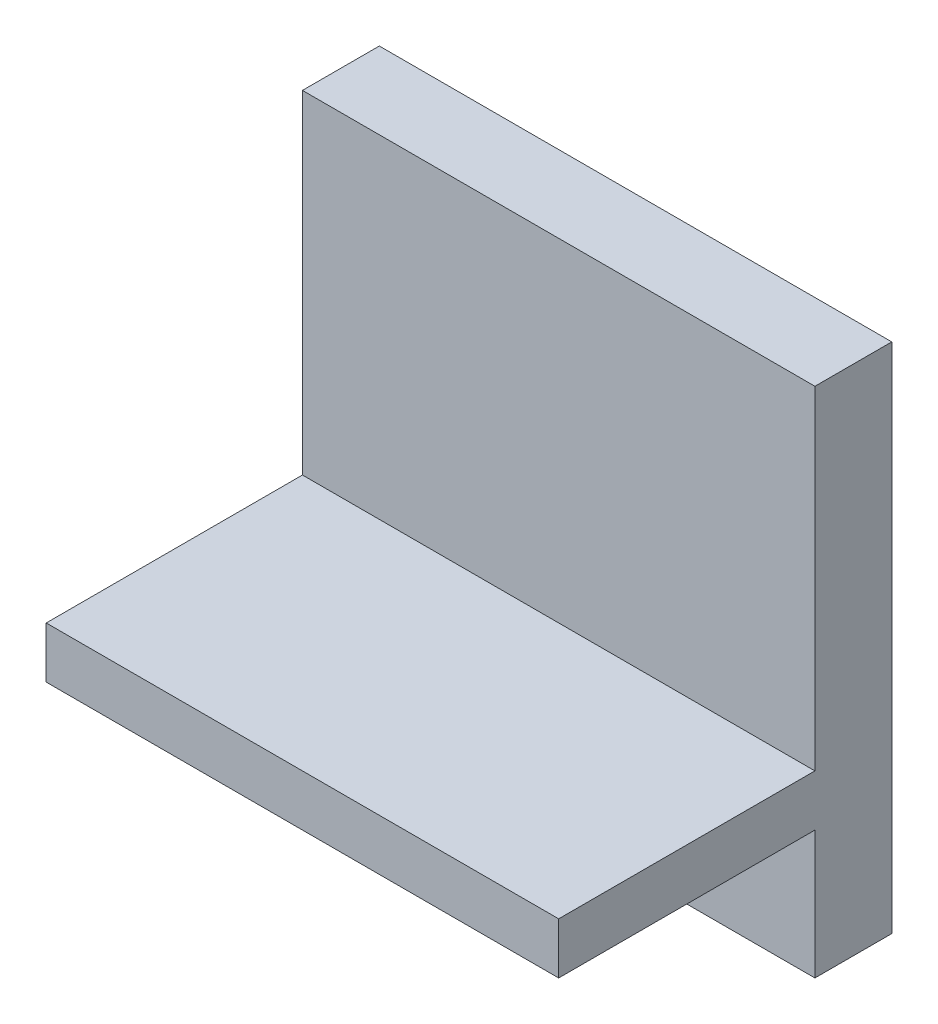
ISO-10303-21;
HEADER;
FILE_DESCRIPTION(('STEP AP214'),'2;1');
FILE_NAME('part.step','',(''),(''),'','','');
FILE_SCHEMA(('AUTOMOTIVE_DESIGN { 1 0 10303 214 1 1 1 1 }'));
ENDSEC;
DATA;
#1=APPLICATION_CONTEXT('core data for automotive mechanical design processes');
#2=APPLICATION_PROTOCOL_DEFINITION('international standard','automotive_design',2000,#1);
#3=PRODUCT_CONTEXT('',#1,'mechanical');
#4=PRODUCT('Part','Part','',(#3));
#5=PRODUCT_RELATED_PRODUCT_CATEGORY('part','',(#4));
#6=PRODUCT_DEFINITION_FORMATION('','',#4);
#7=PRODUCT_DEFINITION_CONTEXT('part definition',#1,'design');
#8=PRODUCT_DEFINITION('design','',#6,#7);
#9=PRODUCT_DEFINITION_SHAPE('','',#8);
#10=(LENGTH_UNIT() NAMED_UNIT(*) SI_UNIT(.MILLI.,.METRE.));
#11=(NAMED_UNIT(*) PLANE_ANGLE_UNIT() SI_UNIT($,.RADIAN.));
#12=(NAMED_UNIT(*) SI_UNIT($,.STERADIAN.) SOLID_ANGLE_UNIT());
#13=UNCERTAINTY_MEASURE_WITH_UNIT(LENGTH_MEASURE(1.E-05),#10,'distance_accuracy_value','');
#14=(GEOMETRIC_REPRESENTATION_CONTEXT(3) GLOBAL_UNCERTAINTY_ASSIGNED_CONTEXT((#13)) GLOBAL_UNIT_ASSIGNED_CONTEXT((#10,
#11,#12)) REPRESENTATION_CONTEXT('',''));
#15=CARTESIAN_POINT('',(0.,0.,0.));
#16=DIRECTION('',(0.,0.,1.));
#17=DIRECTION('',(1.,0.,0.));
#18=AXIS2_PLACEMENT_3D('',#15,#16,#17);
#19=CARTESIAN_POINT('',(0.,20.,0.));
#20=DIRECTION('',(0.,0.,-1.));
#21=DIRECTION('',(-1.,0.,0.));
#22=AXIS2_PLACEMENT_3D('',#19,#20,#21);
#23=PLANE('',#22);
#24=DIRECTION('',(1.,0.,0.));
#25=VECTOR('',#24,1.);
#26=CARTESIAN_POINT('',(15.,5.,0.));
#27=LINE('',#26,#25);
#28=CARTESIAN_POINT('',(0.,5.,0.));
#29=VERTEX_POINT('',#28);
#30=CARTESIAN_POINT('',(5.,5.,0.));
#31=VERTEX_POINT('',#30);
#32=EDGE_CURVE('E153',#29,#31,#27,.T.);
#33=ORIENTED_EDGE('',*,*,#32,.F.);
#34=DIRECTION('',(0.,-1.,0.));
#35=VECTOR('',#34,1.);
#36=CARTESIAN_POINT('',(0.,20.,0.));
#37=LINE('',#36,#35);
#38=CARTESIAN_POINT('',(0.,0.,0.));
#39=VERTEX_POINT('',#38);
#40=EDGE_CURVE('E41',#29,#39,#37,.T.);
#41=ORIENTED_EDGE('',*,*,#40,.T.);
#42=DIRECTION('',(1.,0.,0.));
#43=VECTOR('',#42,1.);
#44=CARTESIAN_POINT('',(0.,0.,0.));
#45=LINE('',#44,#43);
#46=CARTESIAN_POINT('',(5.,0.,0.));
#47=VERTEX_POINT('',#46);
#48=EDGE_CURVE('E56',#39,#47,#45,.T.);
#49=ORIENTED_EDGE('',*,*,#48,.T.);
#50=DIRECTION('',(0.,-1.,0.));
#51=VECTOR('',#50,1.);
#52=CARTESIAN_POINT('',(5.,0.,0.));
#53=LINE('',#52,#51);
#54=EDGE_CURVE('E165',#31,#47,#53,.T.);
#55=ORIENTED_EDGE('',*,*,#54,.F.);
#56=EDGE_LOOP('',(#33,#41,#49,#55));
#57=FACE_BOUND('',#56,.T.);
#58=ADVANCED_FACE('F33',(#57),#23,.F.);
#59=CARTESIAN_POINT('',(15.,5.,0.));
#60=VERTEX_POINT('',#59);
#61=CARTESIAN_POINT('',(20.,5.,0.));
#62=VERTEX_POINT('',#61);
#63=EDGE_CURVE('E139',#60,#62,#27,.T.);
#64=ORIENTED_EDGE('',*,*,#63,.F.);
#65=DIRECTION('',(0.,1.,0.));
#66=VECTOR('',#65,1.);
#67=CARTESIAN_POINT('',(15.,5.,0.));
#68=LINE('',#67,#66);
#69=CARTESIAN_POINT('',(15.,0.,0.));
#70=VERTEX_POINT('',#69);
#71=EDGE_CURVE('E48',#70,#60,#68,.T.);
#72=ORIENTED_EDGE('',*,*,#71,.F.);
#73=CARTESIAN_POINT('',(20.,0.,0.));
#74=VERTEX_POINT('',#73);
#75=EDGE_CURVE('E200',#70,#74,#45,.T.);
#76=ORIENTED_EDGE('',*,*,#75,.T.);
#77=DIRECTION('',(0.,-1.,0.));
#78=VECTOR('',#77,1.);
#79=CARTESIAN_POINT('',(20.,20.,0.));
#80=LINE('',#79,#78);
#81=EDGE_CURVE('E209',#62,#74,#80,.T.);
#82=ORIENTED_EDGE('',*,*,#81,.F.);
#83=EDGE_LOOP('',(#64,#72,#76,#82));
#84=FACE_BOUND('',#83,.T.);
#85=ADVANCED_FACE('F215',(#84),#23,.F.);
#86=DIRECTION('',(-1.,0.,0.));
#87=VECTOR('',#86,1.);
#88=CARTESIAN_POINT('',(20.,7.,0.));
#89=LINE('',#88,#87);
#90=CARTESIAN_POINT('',(20.,7.,0.));
#91=VERTEX_POINT('',#90);
#92=CARTESIAN_POINT('',(0.,7.,0.));
#93=VERTEX_POINT('',#92);
#94=EDGE_CURVE('E134',#91,#93,#89,.T.);
#95=ORIENTED_EDGE('',*,*,#94,.F.);
#96=CARTESIAN_POINT('',(20.,20.,0.));
#97=VERTEX_POINT('',#96);
#98=EDGE_CURVE('E210',#97,#91,#80,.T.);
#99=ORIENTED_EDGE('',*,*,#98,.F.);
#100=DIRECTION('',(1.,0.,0.));
#101=VECTOR('',#100,1.);
#102=CARTESIAN_POINT('',(0.,20.,0.));
#103=LINE('',#102,#101);
#104=CARTESIAN_POINT('',(0.,20.,0.));
#105=VERTEX_POINT('',#104);
#106=EDGE_CURVE('E190',#105,#97,#103,.T.);
#107=ORIENTED_EDGE('',*,*,#106,.F.);
#108=EDGE_CURVE('E11',#105,#93,#37,.T.);
#109=ORIENTED_EDGE('',*,*,#108,.T.);
#110=EDGE_LOOP('',(#95,#99,#107,#109));
#111=FACE_BOUND('',#110,.T.);
#112=ADVANCED_FACE('F233',(#111),#23,.F.);
#113=CARTESIAN_POINT('',(0.,20.,-3.));
#114=DIRECTION('',(1.,0.,0.));
#115=DIRECTION('',(0.,0.,-1.));
#116=AXIS2_PLACEMENT_3D('',#113,#114,#115);
#117=PLANE('',#116);
#118=DIRECTION('',(0.,0.,1.));
#119=VECTOR('',#118,1.);
#120=CARTESIAN_POINT('',(0.,0.,-3.));
#121=LINE('',#120,#119);
#122=CARTESIAN_POINT('',(0.,0.,-3.));
#123=VERTEX_POINT('',#122);
#124=EDGE_CURVE('E186',#123,#39,#121,.T.);
#125=ORIENTED_EDGE('',*,*,#124,.T.);
#126=ORIENTED_EDGE('',*,*,#40,.F.);
#127=DIRECTION('',(0.,0.,-1.));
#128=VECTOR('',#127,1.);
#129=CARTESIAN_POINT('',(0.,5.,10.));
#130=LINE('',#129,#128);
#131=CARTESIAN_POINT('',(0.,5.,10.));
#132=VERTEX_POINT('',#131);
#133=EDGE_CURVE('E152',#132,#29,#130,.T.);
#134=ORIENTED_EDGE('',*,*,#133,.F.);
#135=DIRECTION('',(0.,-1.,0.));
#136=VECTOR('',#135,1.);
#137=CARTESIAN_POINT('',(0.,7.,10.));
#138=LINE('',#137,#136);
#139=CARTESIAN_POINT('',(0.,7.,10.));
#140=VERTEX_POINT('',#139);
#141=EDGE_CURVE('E131',#140,#132,#138,.T.);
#142=ORIENTED_EDGE('',*,*,#141,.F.);
#143=DIRECTION('',(0.,0.,-1.));
#144=VECTOR('',#143,1.);
#145=CARTESIAN_POINT('',(0.,7.,10.));
#146=LINE('',#145,#144);
#147=EDGE_CURVE('E157',#140,#93,#146,.T.);
#148=ORIENTED_EDGE('',*,*,#147,.T.);
#149=ORIENTED_EDGE('',*,*,#108,.F.);
#150=DIRECTION('',(0.,0.,1.));
#151=VECTOR('',#150,1.);
#152=CARTESIAN_POINT('',(0.,20.,-3.));
#153=LINE('',#152,#151);
#154=CARTESIAN_POINT('',(0.,20.,-3.));
#155=VERTEX_POINT('',#154);
#156=EDGE_CURVE('E187',#155,#105,#153,.T.);
#157=ORIENTED_EDGE('',*,*,#156,.F.);
#158=DIRECTION('',(0.,-1.,0.));
#159=VECTOR('',#158,1.);
#160=CARTESIAN_POINT('',(0.,20.,-3.));
#161=LINE('',#160,#159);
#162=EDGE_CURVE('E197',#155,#123,#161,.T.);
#163=ORIENTED_EDGE('',*,*,#162,.T.);
#164=EDGE_LOOP('',(#125,#126,#134,#142,#148,#149,#157,#163));
#165=FACE_BOUND('',#164,.T.);
#166=ADVANCED_FACE('F35',(#165),#117,.F.);
#167=CARTESIAN_POINT('',(20.,20.,0.));
#168=DIRECTION('',(-1.,0.,0.));
#169=DIRECTION('',(0.,0.,1.));
#170=AXIS2_PLACEMENT_3D('',#167,#168,#169);
#171=PLANE('',#170);
#172=DIRECTION('',(0.,0.,-1.));
#173=VECTOR('',#172,1.);
#174=CARTESIAN_POINT('',(20.,0.,0.));
#175=LINE('',#174,#173);
#176=CARTESIAN_POINT('',(20.,0.,-3.));
#177=VERTEX_POINT('',#176);
#178=EDGE_CURVE('E202',#74,#177,#175,.T.);
#179=ORIENTED_EDGE('',*,*,#178,.T.);
#180=DIRECTION('',(0.,-1.,0.));
#181=VECTOR('',#180,1.);
#182=CARTESIAN_POINT('',(20.,20.,-3.));
#183=LINE('',#182,#181);
#184=CARTESIAN_POINT('',(20.,20.,-3.));
#185=VERTEX_POINT('',#184);
#186=EDGE_CURVE('E207',#185,#177,#183,.T.);
#187=ORIENTED_EDGE('',*,*,#186,.F.);
#188=DIRECTION('',(0.,0.,-1.));
#189=VECTOR('',#188,1.);
#190=CARTESIAN_POINT('',(20.,20.,0.));
#191=LINE('',#190,#189);
#192=EDGE_CURVE('E193',#97,#185,#191,.T.);
#193=ORIENTED_EDGE('',*,*,#192,.F.);
#194=ORIENTED_EDGE('',*,*,#98,.T.);
#195=DIRECTION('',(0.,0.,-1.));
#196=VECTOR('',#195,1.);
#197=CARTESIAN_POINT('',(20.,7.,10.));
#198=LINE('',#197,#196);
#199=CARTESIAN_POINT('',(20.,7.,10.));
#200=VERTEX_POINT('',#199);
#201=EDGE_CURVE('E142',#200,#91,#198,.T.);
#202=ORIENTED_EDGE('',*,*,#201,.F.);
#203=DIRECTION('',(0.,1.,0.));
#204=VECTOR('',#203,1.);
#205=CARTESIAN_POINT('',(20.,5.,10.));
#206=LINE('',#205,#204);
#207=CARTESIAN_POINT('',(20.,5.,10.));
#208=VERTEX_POINT('',#207);
#209=EDGE_CURVE('E128',#208,#200,#206,.T.);
#210=ORIENTED_EDGE('',*,*,#209,.F.);
#211=DIRECTION('',(0.,0.,-1.));
#212=VECTOR('',#211,1.);
#213=CARTESIAN_POINT('',(20.,5.,10.));
#214=LINE('',#213,#212);
#215=EDGE_CURVE('E137',#208,#62,#214,.T.);
#216=ORIENTED_EDGE('',*,*,#215,.T.);
#217=ORIENTED_EDGE('',*,*,#81,.T.);
#218=EDGE_LOOP('',(#179,#187,#193,#194,#202,#210,#216,#217));
#219=FACE_BOUND('',#218,.T.);
#220=ADVANCED_FACE('F144',(#219),#171,.F.);
#221=CARTESIAN_POINT('',(20.,20.,-3.));
#222=DIRECTION('',(0.,0.,1.));
#223=DIRECTION('',(1.,0.,0.));
#224=AXIS2_PLACEMENT_3D('',#221,#222,#223);
#225=PLANE('',#224);
#226=DIRECTION('',(-1.,0.,0.));
#227=VECTOR('',#226,1.);
#228=CARTESIAN_POINT('',(20.,0.,-3.));
#229=LINE('',#228,#227);
#230=EDGE_CURVE('E191',#177,#123,#229,.T.);
#231=ORIENTED_EDGE('',*,*,#230,.T.);
#232=ORIENTED_EDGE('',*,*,#162,.F.);
#233=DIRECTION('',(-1.,0.,0.));
#234=VECTOR('',#233,1.);
#235=CARTESIAN_POINT('',(20.,20.,-3.));
#236=LINE('',#235,#234);
#237=EDGE_CURVE('E195',#185,#155,#236,.T.);
#238=ORIENTED_EDGE('',*,*,#237,.F.);
#239=ORIENTED_EDGE('',*,*,#186,.T.);
#240=EDGE_LOOP('',(#231,#232,#238,#239));
#241=FACE_BOUND('',#240,.T.);
#242=ADVANCED_FACE('F223',(#241),#225,.F.);
#243=CARTESIAN_POINT('',(0.,20.,0.));
#244=DIRECTION('',(0.,1.,0.));
#245=DIRECTION('',(0.,0.,1.));
#246=AXIS2_PLACEMENT_3D('',#243,#244,#245);
#247=PLANE('',#246);
#248=ORIENTED_EDGE('',*,*,#156,.T.);
#249=ORIENTED_EDGE('',*,*,#106,.T.);
#250=ORIENTED_EDGE('',*,*,#192,.T.);
#251=ORIENTED_EDGE('',*,*,#237,.T.);
#252=EDGE_LOOP('',(#248,#249,#250,#251));
#253=FACE_BOUND('',#252,.T.);
#254=ADVANCED_FACE('F230',(#253),#247,.T.);
#255=CARTESIAN_POINT('',(0.,0.,0.));
#256=DIRECTION('',(0.,1.,0.));
#257=DIRECTION('',(0.,0.,1.));
#258=AXIS2_PLACEMENT_3D('',#255,#256,#257);
#259=PLANE('',#258);
#260=ORIENTED_EDGE('',*,*,#124,.F.);
#261=ORIENTED_EDGE('',*,*,#230,.F.);
#262=ORIENTED_EDGE('',*,*,#178,.F.);
#263=ORIENTED_EDGE('',*,*,#75,.F.);
#264=DIRECTION('',(0.,0.,-1.));
#265=VECTOR('',#264,1.);
#266=CARTESIAN_POINT('',(15.,0.,3.));
#267=LINE('',#266,#265);
#268=CARTESIAN_POINT('',(15.,0.,3.));
#269=VERTEX_POINT('',#268);
#270=EDGE_CURVE('E183',#269,#70,#267,.T.);
#271=ORIENTED_EDGE('',*,*,#270,.F.);
#272=DIRECTION('',(1.,0.,0.));
#273=VECTOR('',#272,1.);
#274=CARTESIAN_POINT('',(15.,0.,3.));
#275=LINE('',#274,#273);
#276=CARTESIAN_POINT('',(5.,0.,3.));
#277=VERTEX_POINT('',#276);
#278=EDGE_CURVE('E161',#277,#269,#275,.T.);
#279=ORIENTED_EDGE('',*,*,#278,.F.);
#280=DIRECTION('',(0.,0.,-1.));
#281=VECTOR('',#280,1.);
#282=CARTESIAN_POINT('',(5.,0.,3.));
#283=LINE('',#282,#281);
#284=EDGE_CURVE('E173',#277,#47,#283,.T.);
#285=ORIENTED_EDGE('',*,*,#284,.T.);
#286=ORIENTED_EDGE('',*,*,#48,.F.);
#287=EDGE_LOOP('',(#260,#261,#262,#263,#271,#279,#285,#286));
#288=FACE_BOUND('',#287,.T.);
#289=ADVANCED_FACE('F220',(#288),#259,.F.);
#290=CARTESIAN_POINT('',(15.,5.,3.));
#291=DIRECTION('',(-1.,0.,0.));
#292=DIRECTION('',(0.,-1.,0.));
#293=AXIS2_PLACEMENT_3D('',#290,#291,#292);
#294=PLANE('',#293);
#295=ORIENTED_EDGE('',*,*,#71,.T.);
#296=DIRECTION('',(0.,0.,-1.));
#297=VECTOR('',#296,1.);
#298=CARTESIAN_POINT('',(15.,5.,3.));
#299=LINE('',#298,#297);
#300=CARTESIAN_POINT('',(15.,5.,3.));
#301=VERTEX_POINT('',#300);
#302=EDGE_CURVE('E181',#301,#60,#299,.T.);
#303=ORIENTED_EDGE('',*,*,#302,.F.);
#304=DIRECTION('',(0.,1.,0.));
#305=VECTOR('',#304,1.);
#306=CARTESIAN_POINT('',(15.,5.,3.));
#307=LINE('',#306,#305);
#308=EDGE_CURVE('E164',#269,#301,#307,.T.);
#309=ORIENTED_EDGE('',*,*,#308,.F.);
#310=ORIENTED_EDGE('',*,*,#270,.T.);
#311=EDGE_LOOP('',(#295,#303,#309,#310));
#312=FACE_BOUND('',#311,.T.);
#313=ADVANCED_FACE('F247',(#312),#294,.F.);
#314=CARTESIAN_POINT('',(5.,0.,3.));
#315=DIRECTION('',(1.,0.,0.));
#316=DIRECTION('',(0.,1.,0.));
#317=AXIS2_PLACEMENT_3D('',#314,#315,#316);
#318=PLANE('',#317);
#319=ORIENTED_EDGE('',*,*,#54,.T.);
#320=ORIENTED_EDGE('',*,*,#284,.F.);
#321=DIRECTION('',(0.,-1.,0.));
#322=VECTOR('',#321,1.);
#323=CARTESIAN_POINT('',(5.,0.,3.));
#324=LINE('',#323,#322);
#325=CARTESIAN_POINT('',(5.,5.,3.));
#326=VERTEX_POINT('',#325);
#327=EDGE_CURVE('E171',#326,#277,#324,.T.);
#328=ORIENTED_EDGE('',*,*,#327,.F.);
#329=DIRECTION('',(0.,0.,-1.));
#330=VECTOR('',#329,1.);
#331=CARTESIAN_POINT('',(5.,5.,3.));
#332=LINE('',#331,#330);
#333=EDGE_CURVE('E178',#326,#31,#332,.T.);
#334=ORIENTED_EDGE('',*,*,#333,.T.);
#335=EDGE_LOOP('',(#319,#320,#328,#334));
#336=FACE_BOUND('',#335,.T.);
#337=ADVANCED_FACE('F241',(#336),#318,.F.);
#338=CARTESIAN_POINT('',(0.,0.,3.));
#339=DIRECTION('',(0.,0.,-1.));
#340=DIRECTION('',(-1.,0.,0.));
#341=AXIS2_PLACEMENT_3D('',#338,#339,#340);
#342=PLANE('',#341);
#343=ORIENTED_EDGE('',*,*,#278,.T.);
#344=ORIENTED_EDGE('',*,*,#308,.T.);
#345=DIRECTION('',(-1.,0.,0.));
#346=VECTOR('',#345,1.);
#347=CARTESIAN_POINT('',(5.,5.,3.));
#348=LINE('',#347,#346);
#349=EDGE_CURVE('E168',#301,#326,#348,.T.);
#350=ORIENTED_EDGE('',*,*,#349,.T.);
#351=ORIENTED_EDGE('',*,*,#327,.T.);
#352=EDGE_LOOP('',(#343,#344,#350,#351));
#353=FACE_BOUND('',#352,.T.);
#354=ADVANCED_FACE('F243',(#353),#342,.F.);
#355=CARTESIAN_POINT('',(15.,5.,10.));
#356=DIRECTION('',(0.,1.,0.));
#357=DIRECTION('',(-1.,0.,0.));
#358=AXIS2_PLACEMENT_3D('',#355,#356,#357);
#359=PLANE('',#358);
#360=ORIENTED_EDGE('',*,*,#349,.F.);
#361=ORIENTED_EDGE('',*,*,#302,.T.);
#362=ORIENTED_EDGE('',*,*,#63,.T.);
#363=ORIENTED_EDGE('',*,*,#215,.F.);
#364=DIRECTION('',(1.,0.,0.));
#365=VECTOR('',#364,1.);
#366=CARTESIAN_POINT('',(0.,5.,10.));
#367=LINE('',#366,#365);
#368=EDGE_CURVE('E124',#132,#208,#367,.T.);
#369=ORIENTED_EDGE('',*,*,#368,.F.);
#370=ORIENTED_EDGE('',*,*,#133,.T.);
#371=ORIENTED_EDGE('',*,*,#32,.T.);
#372=ORIENTED_EDGE('',*,*,#333,.F.);
#373=EDGE_LOOP('',(#360,#361,#362,#363,#369,#370,#371,#372));
#374=FACE_BOUND('',#373,.T.);
#375=ADVANCED_FACE('F138',(#374),#359,.F.);
#376=CARTESIAN_POINT('',(20.,7.,10.));
#377=DIRECTION('',(0.,-1.,0.));
#378=DIRECTION('',(1.,0.,0.));
#379=AXIS2_PLACEMENT_3D('',#376,#377,#378);
#380=PLANE('',#379);
#381=ORIENTED_EDGE('',*,*,#94,.T.);
#382=ORIENTED_EDGE('',*,*,#147,.F.);
#383=DIRECTION('',(-1.,0.,0.));
#384=VECTOR('',#383,1.);
#385=CARTESIAN_POINT('',(20.,7.,10.));
#386=LINE('',#385,#384);
#387=EDGE_CURVE('E147',#200,#140,#386,.T.);
#388=ORIENTED_EDGE('',*,*,#387,.F.);
#389=ORIENTED_EDGE('',*,*,#201,.T.);
#390=EDGE_LOOP('',(#381,#382,#388,#389));
#391=FACE_BOUND('',#390,.T.);
#392=ADVANCED_FACE('F236',(#391),#380,.F.);
#393=CARTESIAN_POINT('',(0.,0.,10.));
#394=DIRECTION('',(0.,0.,1.));
#395=DIRECTION('',(1.,0.,0.));
#396=AXIS2_PLACEMENT_3D('',#393,#394,#395);
#397=PLANE('',#396);
#398=ORIENTED_EDGE('',*,*,#368,.T.);
#399=ORIENTED_EDGE('',*,*,#209,.T.);
#400=ORIENTED_EDGE('',*,*,#387,.T.);
#401=ORIENTED_EDGE('',*,*,#141,.T.);
#402=EDGE_LOOP('',(#398,#399,#400,#401));
#403=FACE_BOUND('',#402,.T.);
#404=ADVANCED_FACE('F126',(#403),#397,.T.);
#405=CLOSED_SHELL('',(#58,#85,#112,#166,#220,#242,#254,#289,#313,#337,#354,#375,#392,#404));
#406=MANIFOLD_SOLID_BREP('B2',#405);
#407=ADVANCED_BREP_SHAPE_REPRESENTATION('',(#18,#406),#14);
#408=SHAPE_DEFINITION_REPRESENTATION(#9,#407);
ENDSEC;
END-ISO-10303-21;
